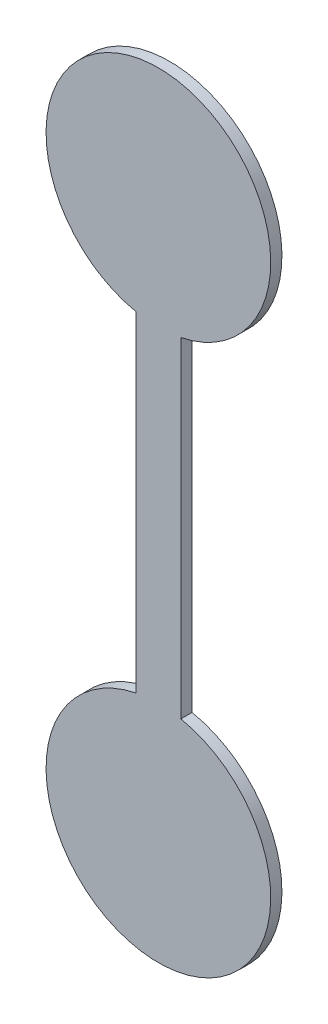
ISO-10303-21;
HEADER;
FILE_DESCRIPTION(('STEP AP214'),'2;1');
FILE_NAME('part.step','',(''),(''),'','','');
FILE_SCHEMA(('AUTOMOTIVE_DESIGN { 1 0 10303 214 1 1 1 1 }'));
ENDSEC;
DATA;
#1=APPLICATION_CONTEXT('core data for automotive mechanical design processes');
#2=APPLICATION_PROTOCOL_DEFINITION('international standard','automotive_design',2000,#1);
#3=PRODUCT_CONTEXT('',#1,'mechanical');
#4=PRODUCT('Part','Part','',(#3));
#5=PRODUCT_RELATED_PRODUCT_CATEGORY('part','',(#4));
#6=PRODUCT_DEFINITION_FORMATION('','',#4);
#7=PRODUCT_DEFINITION_CONTEXT('part definition',#1,'design');
#8=PRODUCT_DEFINITION('design','',#6,#7);
#9=PRODUCT_DEFINITION_SHAPE('','',#8);
#10=(LENGTH_UNIT() NAMED_UNIT(*) SI_UNIT(.MILLI.,.METRE.));
#11=(NAMED_UNIT(*) PLANE_ANGLE_UNIT() SI_UNIT($,.RADIAN.));
#12=(NAMED_UNIT(*) SI_UNIT($,.STERADIAN.) SOLID_ANGLE_UNIT());
#13=UNCERTAINTY_MEASURE_WITH_UNIT(LENGTH_MEASURE(1.E-05),#10,'distance_accuracy_value','');
#14=(GEOMETRIC_REPRESENTATION_CONTEXT(3) GLOBAL_UNCERTAINTY_ASSIGNED_CONTEXT((#13)) GLOBAL_UNIT_ASSIGNED_CONTEXT((#10,
#11,#12)) REPRESENTATION_CONTEXT('',''));
#15=CARTESIAN_POINT('',(0.,0.,0.));
#16=DIRECTION('',(0.,0.,1.));
#17=DIRECTION('',(1.,0.,0.));
#18=AXIS2_PLACEMENT_3D('',#15,#16,#17);
#19=CARTESIAN_POINT('',(0.,490.,5.));
#20=DIRECTION('',(0.,0.,-1.));
#21=DIRECTION('',(-1.,0.,0.));
#22=AXIS2_PLACEMENT_3D('',#19,#20,#21);
#23=CYLINDRICAL_SURFACE('',#22,100.);
#24=CARTESIAN_POINT('',(0.,490.,-5.));
#25=DIRECTION('',(0.,0.,1.));
#26=DIRECTION('',(1.,0.,0.));
#27=AXIS2_PLACEMENT_3D('',#24,#25,#26);
#28=CIRCLE('',#27,100.);
#29=CARTESIAN_POINT('',(20.,392.020410288673,-5.));
#30=VERTEX_POINT('',#29);
#31=CARTESIAN_POINT('',(-20.,392.020410288673,-5.));
#32=VERTEX_POINT('',#31);
#33=EDGE_CURVE('E141',#30,#32,#28,.T.);
#34=ORIENTED_EDGE('',*,*,#33,.T.);
#35=DIRECTION('',(0.,0.,-1.));
#36=VECTOR('',#35,1.);
#37=CARTESIAN_POINT('',(-20.,392.020410288673,5.));
#38=LINE('',#37,#36);
#39=CARTESIAN_POINT('',(-20.,392.020410288673,5.));
#40=VERTEX_POINT('',#39);
#41=EDGE_CURVE('E94',#40,#32,#38,.T.);
#42=ORIENTED_EDGE('',*,*,#41,.F.);
#43=CARTESIAN_POINT('',(0.,490.,5.));
#44=DIRECTION('',(0.,0.,1.));
#45=DIRECTION('',(1.,0.,0.));
#46=AXIS2_PLACEMENT_3D('',#43,#44,#45);
#47=CIRCLE('',#46,100.);
#48=CARTESIAN_POINT('',(20.,392.020410288673,5.));
#49=VERTEX_POINT('',#48);
#50=EDGE_CURVE('E152',#49,#40,#47,.T.);
#51=ORIENTED_EDGE('',*,*,#50,.F.);
#52=DIRECTION('',(0.,0.,-1.));
#53=VECTOR('',#52,1.);
#54=CARTESIAN_POINT('',(20.,392.020410288673,5.));
#55=LINE('',#54,#53);
#56=EDGE_CURVE('E12',#49,#30,#55,.T.);
#57=ORIENTED_EDGE('',*,*,#56,.T.);
#58=EDGE_LOOP('',(#34,#42,#51,#57));
#59=FACE_BOUND('',#58,.T.);
#60=ADVANCED_FACE('F84',(#59),#23,.T.);
#61=CARTESIAN_POINT('',(0.,0.,-5.));
#62=DIRECTION('',(0.,0.,1.));
#63=DIRECTION('',(1.,0.,0.));
#64=AXIS2_PLACEMENT_3D('',#61,#62,#63);
#65=PLANE('',#64);
#66=CARTESIAN_POINT('',(0.,0.,-5.));
#67=DIRECTION('',(0.,0.,1.));
#68=DIRECTION('',(1.,0.,0.));
#69=AXIS2_PLACEMENT_3D('',#66,#67,#68);
#70=CIRCLE('',#69,100.);
#71=CARTESIAN_POINT('',(-20.,97.9795897113271,-5.));
#72=VERTEX_POINT('',#71);
#73=CARTESIAN_POINT('',(20.,97.9795897113271,-5.));
#74=VERTEX_POINT('',#73);
#75=EDGE_CURVE('E140',#72,#74,#70,.T.);
#76=ORIENTED_EDGE('',*,*,#75,.F.);
#77=DIRECTION('',(0.,1.,0.));
#78=VECTOR('',#77,1.);
#79=CARTESIAN_POINT('',(-20.,0.,-5.));
#80=LINE('',#79,#78);
#81=EDGE_CURVE('E88',#72,#32,#80,.T.);
#82=ORIENTED_EDGE('',*,*,#81,.T.);
#83=ORIENTED_EDGE('',*,*,#33,.F.);
#84=DIRECTION('',(0.,1.,0.));
#85=VECTOR('',#84,1.);
#86=CARTESIAN_POINT('',(20.,0.,-5.));
#87=LINE('',#86,#85);
#88=EDGE_CURVE('E129',#74,#30,#87,.T.);
#89=ORIENTED_EDGE('',*,*,#88,.F.);
#90=EDGE_LOOP('',(#76,#82,#83,#89));
#91=FACE_BOUND('',#90,.T.);
#92=ADVANCED_FACE('F138',(#91),#65,.F.);
#93=CARTESIAN_POINT('',(0.,0.,5.));
#94=DIRECTION('',(0.,0.,1.));
#95=DIRECTION('',(1.,0.,0.));
#96=AXIS2_PLACEMENT_3D('',#93,#94,#95);
#97=PLANE('',#96);
#98=DIRECTION('',(0.,1.,0.));
#99=VECTOR('',#98,1.);
#100=CARTESIAN_POINT('',(-20.,0.,5.));
#101=LINE('',#100,#99);
#102=CARTESIAN_POINT('',(-20.,97.9795897113271,5.));
#103=VERTEX_POINT('',#102);
#104=EDGE_CURVE('E143',#103,#40,#101,.T.);
#105=ORIENTED_EDGE('',*,*,#104,.F.);
#106=CARTESIAN_POINT('',(0.,0.,5.));
#107=DIRECTION('',(0.,0.,1.));
#108=DIRECTION('',(1.,0.,0.));
#109=AXIS2_PLACEMENT_3D('',#106,#107,#108);
#110=CIRCLE('',#109,100.);
#111=CARTESIAN_POINT('',(20.,97.9795897113271,5.));
#112=VERTEX_POINT('',#111);
#113=EDGE_CURVE('E134',#103,#112,#110,.T.);
#114=ORIENTED_EDGE('',*,*,#113,.T.);
#115=DIRECTION('',(0.,1.,0.));
#116=VECTOR('',#115,1.);
#117=CARTESIAN_POINT('',(20.,0.,5.));
#118=LINE('',#117,#116);
#119=EDGE_CURVE('E132',#112,#49,#118,.T.);
#120=ORIENTED_EDGE('',*,*,#119,.T.);
#121=ORIENTED_EDGE('',*,*,#50,.T.);
#122=EDGE_LOOP('',(#105,#114,#120,#121));
#123=FACE_BOUND('',#122,.T.);
#124=ADVANCED_FACE('F158',(#123),#97,.T.);
#125=CARTESIAN_POINT('',(0.,0.,5.));
#126=DIRECTION('',(0.,0.,-1.));
#127=DIRECTION('',(-1.,0.,0.));
#128=AXIS2_PLACEMENT_3D('',#125,#126,#127);
#129=CYLINDRICAL_SURFACE('',#128,100.);
#130=ORIENTED_EDGE('',*,*,#75,.T.);
#131=DIRECTION('',(0.,0.,-1.));
#132=VECTOR('',#131,1.);
#133=CARTESIAN_POINT('',(20.,97.9795897113271,5.));
#134=LINE('',#133,#132);
#135=EDGE_CURVE('E127',#112,#74,#134,.T.);
#136=ORIENTED_EDGE('',*,*,#135,.F.);
#137=ORIENTED_EDGE('',*,*,#113,.F.);
#138=DIRECTION('',(0.,0.,-1.));
#139=VECTOR('',#138,1.);
#140=CARTESIAN_POINT('',(-20.,97.9795897113271,5.));
#141=LINE('',#140,#139);
#142=EDGE_CURVE('E121',#103,#72,#141,.T.);
#143=ORIENTED_EDGE('',*,*,#142,.T.);
#144=EDGE_LOOP('',(#130,#136,#137,#143));
#145=FACE_BOUND('',#144,.T.);
#146=ADVANCED_FACE('F142',(#145),#129,.T.);
#147=CARTESIAN_POINT('',(20.,0.,5.));
#148=DIRECTION('',(-1.,0.,0.));
#149=DIRECTION('',(0.,0.,1.));
#150=AXIS2_PLACEMENT_3D('',#147,#148,#149);
#151=PLANE('',#150);
#152=ORIENTED_EDGE('',*,*,#88,.T.);
#153=ORIENTED_EDGE('',*,*,#56,.F.);
#154=ORIENTED_EDGE('',*,*,#119,.F.);
#155=ORIENTED_EDGE('',*,*,#135,.T.);
#156=EDGE_LOOP('',(#152,#153,#154,#155));
#157=FACE_BOUND('',#156,.T.);
#158=ADVANCED_FACE('F86',(#157),#151,.F.);
#159=CARTESIAN_POINT('',(-20.,0.,5.));
#160=DIRECTION('',(-1.,0.,0.));
#161=DIRECTION('',(0.,0.,1.));
#162=AXIS2_PLACEMENT_3D('',#159,#160,#161);
#163=PLANE('',#162);
#164=ORIENTED_EDGE('',*,*,#104,.T.);
#165=ORIENTED_EDGE('',*,*,#41,.T.);
#166=ORIENTED_EDGE('',*,*,#81,.F.);
#167=ORIENTED_EDGE('',*,*,#142,.F.);
#168=EDGE_LOOP('',(#164,#165,#166,#167));
#169=FACE_BOUND('',#168,.T.);
#170=ADVANCED_FACE('F156',(#169),#163,.T.);
#171=CLOSED_SHELL('',(#60,#92,#124,#146,#158,#170));
#172=MANIFOLD_SOLID_BREP('B2',#171);
#173=ADVANCED_BREP_SHAPE_REPRESENTATION('',(#18,#172),#14);
#174=SHAPE_DEFINITION_REPRESENTATION(#9,#173);
ENDSEC;
END-ISO-10303-21;
